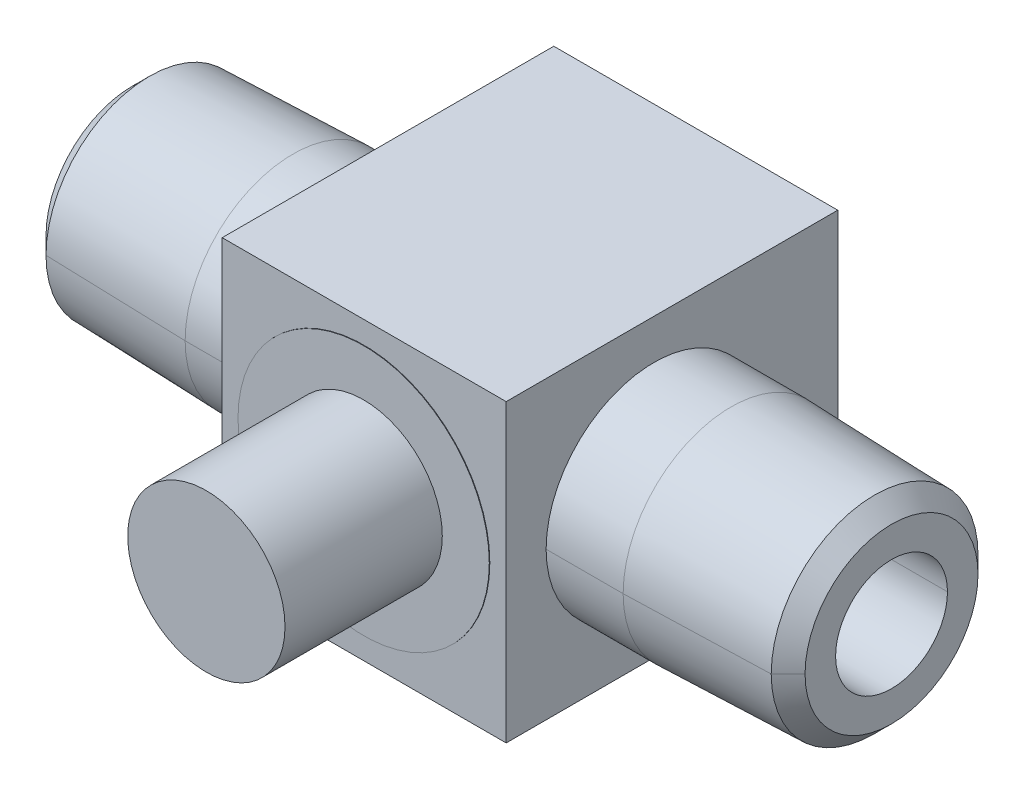
ISO-10303-21;
HEADER;
FILE_DESCRIPTION(('STEP AP214'),'2;1');
FILE_NAME('part.step','',(''),(''),'','','');
FILE_SCHEMA(('AUTOMOTIVE_DESIGN { 1 0 10303 214 1 1 1 1 }'));
ENDSEC;
DATA;
#1=APPLICATION_CONTEXT('core data for automotive mechanical design processes');
#2=APPLICATION_PROTOCOL_DEFINITION('international standard','automotive_design',2000,#1);
#3=PRODUCT_CONTEXT('',#1,'mechanical');
#4=PRODUCT('Part','Part','',(#3));
#5=PRODUCT_RELATED_PRODUCT_CATEGORY('part','',(#4));
#6=PRODUCT_DEFINITION_FORMATION('','',#4);
#7=PRODUCT_DEFINITION_CONTEXT('part definition',#1,'design');
#8=PRODUCT_DEFINITION('design','',#6,#7);
#9=PRODUCT_DEFINITION_SHAPE('','',#8);
#10=(LENGTH_UNIT() NAMED_UNIT(*) SI_UNIT(.MILLI.,.METRE.));
#11=(NAMED_UNIT(*) PLANE_ANGLE_UNIT() SI_UNIT($,.RADIAN.));
#12=(NAMED_UNIT(*) SI_UNIT($,.STERADIAN.) SOLID_ANGLE_UNIT());
#13=UNCERTAINTY_MEASURE_WITH_UNIT(LENGTH_MEASURE(1.E-05),#10,'distance_accuracy_value','');
#14=(GEOMETRIC_REPRESENTATION_CONTEXT(3) GLOBAL_UNCERTAINTY_ASSIGNED_CONTEXT((#13)) GLOBAL_UNIT_ASSIGNED_CONTEXT((#10,
#11,#12)) REPRESENTATION_CONTEXT('',''));
#15=CARTESIAN_POINT('',(0.,0.,0.));
#16=DIRECTION('',(0.,0.,1.));
#17=DIRECTION('',(1.,0.,0.));
#18=AXIS2_PLACEMENT_3D('',#15,#16,#17);
#19=CARTESIAN_POINT('',(0.,0.,21.844));
#20=DIRECTION('',(0.,0.,-1.));
#21=DIRECTION('',(1.,0.,0.));
#22=AXIS2_PLACEMENT_3D('',#19,#20,#21);
#23=CYLINDRICAL_SURFACE('',#22,7.9883);
#24=CARTESIAN_POINT('',(0.,0.,21.116));
#25=DIRECTION('',(0.,0.,-1.));
#26=DIRECTION('',(-1.,0.,0.));
#27=AXIS2_PLACEMENT_3D('',#24,#25,#26);
#28=CIRCLE('',#27,7.9883);
#29=CARTESIAN_POINT('',(-7.9883,0.,21.116));
#30=VERTEX_POINT('',#29);
#31=CARTESIAN_POINT('',(7.9883,0.,21.116));
#32=VERTEX_POINT('',#31);
#33=EDGE_CURVE('E57',#30,#32,#28,.F.);
#34=ORIENTED_EDGE('',*,*,#33,.F.);
#35=DIRECTION('',(0.,0.,1.));
#36=VECTOR('',#35,1.);
#37=CARTESIAN_POINT('',(-7.9883,0.,21.844));
#38=LINE('',#37,#36);
#39=CARTESIAN_POINT('',(-7.9883,0.,21.082));
#40=VERTEX_POINT('',#39);
#41=EDGE_CURVE('E69',#40,#30,#38,.T.);
#42=ORIENTED_EDGE('',*,*,#41,.F.);
#43=CARTESIAN_POINT('',(0.,0.,21.082));
#44=DIRECTION('',(0.,0.,-1.));
#45=DIRECTION('',(1.,0.,0.));
#46=AXIS2_PLACEMENT_3D('',#43,#44,#45);
#47=CIRCLE('',#46,7.9883);
#48=CARTESIAN_POINT('',(7.9883,0.,21.082));
#49=VERTEX_POINT('',#48);
#50=EDGE_CURVE('E295',#49,#40,#47,.T.);
#51=ORIENTED_EDGE('',*,*,#50,.F.);
#52=DIRECTION('',(0.,0.,-1.));
#53=VECTOR('',#52,1.);
#54=CARTESIAN_POINT('',(7.9883,0.,21.844));
#55=LINE('',#54,#53);
#56=EDGE_CURVE('E355',#32,#49,#55,.T.);
#57=ORIENTED_EDGE('',*,*,#56,.F.);
#58=EDGE_LOOP('',(#34,#42,#51,#57));
#59=FACE_BOUND('',#58,.T.);
#60=ADVANCED_FACE('F42',(#59),#23,.T.);
#61=CARTESIAN_POINT('',(0.,0.,21.844));
#62=DIRECTION('',(0.,0.,-1.));
#63=DIRECTION('',(1.,0.,0.));
#64=AXIS2_PLACEMENT_3D('',#61,#62,#63);
#65=CYLINDRICAL_SURFACE('',#64,7.9883);
#66=CARTESIAN_POINT('',(0.,0.,21.116));
#67=DIRECTION('',(0.,0.,-1.));
#68=DIRECTION('',(-1.,0.,0.));
#69=AXIS2_PLACEMENT_3D('',#66,#67,#68);
#70=CIRCLE('',#69,7.9883);
#71=EDGE_CURVE('E46',#32,#30,#70,.F.);
#72=ORIENTED_EDGE('',*,*,#71,.F.);
#73=ORIENTED_EDGE('',*,*,#56,.T.);
#74=CARTESIAN_POINT('',(0.,0.,21.082));
#75=DIRECTION('',(0.,0.,-1.));
#76=DIRECTION('',(1.,0.,0.));
#77=AXIS2_PLACEMENT_3D('',#74,#75,#76);
#78=CIRCLE('',#77,7.9883);
#79=EDGE_CURVE('E299',#40,#49,#78,.T.);
#80=ORIENTED_EDGE('',*,*,#79,.F.);
#81=ORIENTED_EDGE('',*,*,#41,.T.);
#82=EDGE_LOOP('',(#72,#73,#80,#81));
#83=FACE_BOUND('',#82,.T.);
#84=ADVANCED_FACE('F397',(#83),#65,.T.);
#85=CARTESIAN_POINT('',(0.,0.,21.082));
#86=DIRECTION('',(0.,0.,1.));
#87=DIRECTION('',(1.,0.,0.));
#88=AXIS2_PLACEMENT_3D('',#85,#86,#87);
#89=PLANE('',#88);
#90=DIRECTION('',(0.,1.,0.));
#91=VECTOR('',#90,1.);
#92=CARTESIAN_POINT('',(9.02716,0.,21.082));
#93=LINE('',#92,#91);
#94=CARTESIAN_POINT('',(9.02716,-9.398,21.082));
#95=VERTEX_POINT('',#94);
#96=CARTESIAN_POINT('',(9.02716,9.398,21.082));
#97=VERTEX_POINT('',#96);
#98=EDGE_CURVE('E300',#95,#97,#93,.T.);
#99=ORIENTED_EDGE('',*,*,#98,.T.);
#100=DIRECTION('',(-1.,0.,0.));
#101=VECTOR('',#100,1.);
#102=CARTESIAN_POINT('',(0.,9.398,21.082));
#103=LINE('',#102,#101);
#104=CARTESIAN_POINT('',(-9.02716,9.398,21.082));
#105=VERTEX_POINT('',#104);
#106=EDGE_CURVE('E345',#97,#105,#103,.T.);
#107=ORIENTED_EDGE('',*,*,#106,.T.);
#108=DIRECTION('',(0.,-1.,0.));
#109=VECTOR('',#108,1.);
#110=CARTESIAN_POINT('',(-9.02716,0.,21.082));
#111=LINE('',#110,#109);
#112=CARTESIAN_POINT('',(-9.02716,-9.398,21.082));
#113=VERTEX_POINT('',#112);
#114=EDGE_CURVE('E340',#105,#113,#111,.T.);
#115=ORIENTED_EDGE('',*,*,#114,.T.);
#116=DIRECTION('',(1.,0.,0.));
#117=VECTOR('',#116,1.);
#118=CARTESIAN_POINT('',(0.,-9.398,21.082));
#119=LINE('',#118,#117);
#120=EDGE_CURVE('E284',#113,#95,#119,.T.);
#121=ORIENTED_EDGE('',*,*,#120,.T.);
#122=EDGE_LOOP('',(#99,#107,#115,#121));
#123=FACE_BOUND('',#122,.T.);
#124=ORIENTED_EDGE('',*,*,#50,.T.);
#125=ORIENTED_EDGE('',*,*,#79,.T.);
#126=EDGE_LOOP('',(#124,#125));
#127=FACE_BOUND('',#126,.T.);
#128=ADVANCED_FACE('F44',(#123,#127),#89,.T.);
#129=CARTESIAN_POINT('',(9.02716,0.,10.541));
#130=DIRECTION('',(-1.,0.,0.));
#131=DIRECTION('',(0.,0.,1.));
#132=AXIS2_PLACEMENT_3D('',#129,#130,#131);
#133=PLANE('',#132);
#134=CARTESIAN_POINT('',(9.02716,0.,11.684));
#135=DIRECTION('',(-1.,0.,0.));
#136=DIRECTION('',(0.,0.,-1.));
#137=AXIS2_PLACEMENT_3D('',#134,#135,#136);
#138=CIRCLE('',#137,6.858);
#139=CARTESIAN_POINT('',(9.02716,0.,4.826));
#140=VERTEX_POINT('',#139);
#141=CARTESIAN_POINT('',(9.02716,0.,18.542));
#142=VERTEX_POINT('',#141);
#143=EDGE_CURVE('E236',#140,#142,#138,.T.);
#144=ORIENTED_EDGE('',*,*,#143,.T.);
#145=CARTESIAN_POINT('',(9.02716,0.,11.684));
#146=DIRECTION('',(-1.,0.,0.));
#147=DIRECTION('',(0.,0.,-1.));
#148=AXIS2_PLACEMENT_3D('',#145,#146,#147);
#149=CIRCLE('',#148,6.858);
#150=EDGE_CURVE('E237',#142,#140,#149,.T.);
#151=ORIENTED_EDGE('',*,*,#150,.T.);
#152=EDGE_LOOP('',(#144,#151));
#153=FACE_BOUND('',#152,.T.);
#154=DIRECTION('',(0.,0.,-1.));
#155=VECTOR('',#154,1.);
#156=CARTESIAN_POINT('',(9.02716,-9.398,10.541));
#157=LINE('',#156,#155);
#158=CARTESIAN_POINT('',(9.02716,-9.398,0.));
#159=VERTEX_POINT('',#158);
#160=EDGE_CURVE('E280',#95,#159,#157,.T.);
#161=ORIENTED_EDGE('',*,*,#160,.T.);
#162=DIRECTION('',(0.,-1.,0.));
#163=VECTOR('',#162,1.);
#164=CARTESIAN_POINT('',(9.02716,0.,0.));
#165=LINE('',#164,#163);
#166=CARTESIAN_POINT('',(9.02716,9.398,0.));
#167=VERTEX_POINT('',#166);
#168=EDGE_CURVE('E310',#167,#159,#165,.T.);
#169=ORIENTED_EDGE('',*,*,#168,.F.);
#170=DIRECTION('',(0.,0.,-1.));
#171=VECTOR('',#170,1.);
#172=CARTESIAN_POINT('',(9.02716,9.398,10.541));
#173=LINE('',#172,#171);
#174=EDGE_CURVE('E341',#97,#167,#173,.T.);
#175=ORIENTED_EDGE('',*,*,#174,.F.);
#176=ORIENTED_EDGE('',*,*,#98,.F.);
#177=EDGE_LOOP('',(#161,#169,#175,#176));
#178=FACE_BOUND('',#177,.T.);
#179=ADVANCED_FACE('F417',(#153,#178),#133,.F.);
#180=CARTESIAN_POINT('',(0.,9.398,10.541));
#181=DIRECTION('',(0.,-1.,0.));
#182=DIRECTION('',(0.,0.,-1.));
#183=AXIS2_PLACEMENT_3D('',#180,#181,#182);
#184=PLANE('',#183);
#185=ORIENTED_EDGE('',*,*,#174,.T.);
#186=DIRECTION('',(1.,0.,0.));
#187=VECTOR('',#186,1.);
#188=CARTESIAN_POINT('',(0.,9.398,0.));
#189=LINE('',#188,#187);
#190=CARTESIAN_POINT('',(-9.02716,9.398,0.));
#191=VERTEX_POINT('',#190);
#192=EDGE_CURVE('E290',#191,#167,#189,.T.);
#193=ORIENTED_EDGE('',*,*,#192,.F.);
#194=DIRECTION('',(0.,0.,-1.));
#195=VECTOR('',#194,1.);
#196=CARTESIAN_POINT('',(-9.02716,9.398,10.541));
#197=LINE('',#196,#195);
#198=EDGE_CURVE('E334',#105,#191,#197,.T.);
#199=ORIENTED_EDGE('',*,*,#198,.F.);
#200=ORIENTED_EDGE('',*,*,#106,.F.);
#201=EDGE_LOOP('',(#185,#193,#199,#200));
#202=FACE_BOUND('',#201,.T.);
#203=ADVANCED_FACE('F420',(#202),#184,.F.);
#204=CARTESIAN_POINT('',(-9.02716,0.,10.541));
#205=DIRECTION('',(1.,0.,0.));
#206=DIRECTION('',(0.,1.,0.));
#207=AXIS2_PLACEMENT_3D('',#204,#205,#206);
#208=PLANE('',#207);
#209=CARTESIAN_POINT('',(-9.02716,0.,11.684));
#210=DIRECTION('',(1.,0.,0.));
#211=DIRECTION('',(0.,0.,-1.));
#212=AXIS2_PLACEMENT_3D('',#209,#210,#211);
#213=CIRCLE('',#212,6.858);
#214=CARTESIAN_POINT('',(-9.02716,0.,4.826));
#215=VERTEX_POINT('',#214);
#216=CARTESIAN_POINT('',(-9.02716,0.,18.542));
#217=VERTEX_POINT('',#216);
#218=EDGE_CURVE('E241',#215,#217,#213,.T.);
#219=ORIENTED_EDGE('',*,*,#218,.T.);
#220=CARTESIAN_POINT('',(-9.02716,0.,11.684));
#221=DIRECTION('',(1.,0.,0.));
#222=DIRECTION('',(0.,0.,-1.));
#223=AXIS2_PLACEMENT_3D('',#220,#221,#222);
#224=CIRCLE('',#223,6.858);
#225=EDGE_CURVE('E212',#217,#215,#224,.T.);
#226=ORIENTED_EDGE('',*,*,#225,.T.);
#227=EDGE_LOOP('',(#219,#226));
#228=FACE_BOUND('',#227,.T.);
#229=ORIENTED_EDGE('',*,*,#198,.T.);
#230=DIRECTION('',(0.,1.,0.));
#231=VECTOR('',#230,1.);
#232=CARTESIAN_POINT('',(-9.02716,0.,0.));
#233=LINE('',#232,#231);
#234=CARTESIAN_POINT('',(-9.02716,-9.398,0.));
#235=VERTEX_POINT('',#234);
#236=EDGE_CURVE('E286',#235,#191,#233,.T.);
#237=ORIENTED_EDGE('',*,*,#236,.F.);
#238=DIRECTION('',(0.,0.,-1.));
#239=VECTOR('',#238,1.);
#240=CARTESIAN_POINT('',(-9.02716,-9.398,10.541));
#241=LINE('',#240,#239);
#242=EDGE_CURVE('E285',#113,#235,#241,.T.);
#243=ORIENTED_EDGE('',*,*,#242,.F.);
#244=ORIENTED_EDGE('',*,*,#114,.F.);
#245=EDGE_LOOP('',(#229,#237,#243,#244));
#246=FACE_BOUND('',#245,.T.);
#247=ADVANCED_FACE('F440',(#228,#246),#208,.F.);
#248=CARTESIAN_POINT('',(0.,-9.398,10.541));
#249=DIRECTION('',(0.,1.,0.));
#250=DIRECTION('',(1.,0.,0.));
#251=AXIS2_PLACEMENT_3D('',#248,#249,#250);
#252=PLANE('',#251);
#253=ORIENTED_EDGE('',*,*,#242,.T.);
#254=DIRECTION('',(-1.,0.,0.));
#255=VECTOR('',#254,1.);
#256=CARTESIAN_POINT('',(0.,-9.398,0.));
#257=LINE('',#256,#255);
#258=EDGE_CURVE('E291',#159,#235,#257,.T.);
#259=ORIENTED_EDGE('',*,*,#258,.F.);
#260=ORIENTED_EDGE('',*,*,#160,.F.);
#261=ORIENTED_EDGE('',*,*,#120,.F.);
#262=EDGE_LOOP('',(#253,#259,#260,#261));
#263=FACE_BOUND('',#262,.T.);
#264=ADVANCED_FACE('F438',(#263),#252,.F.);
#265=CARTESIAN_POINT('',(0.,0.,0.));
#266=DIRECTION('',(0.,0.,1.));
#267=DIRECTION('',(1.,0.,0.));
#268=AXIS2_PLACEMENT_3D('',#265,#266,#267);
#269=PLANE('',#268);
#270=ORIENTED_EDGE('',*,*,#168,.T.);
#271=ORIENTED_EDGE('',*,*,#258,.T.);
#272=ORIENTED_EDGE('',*,*,#236,.T.);
#273=ORIENTED_EDGE('',*,*,#192,.T.);
#274=EDGE_LOOP('',(#270,#271,#272,#273));
#275=FACE_BOUND('',#274,.T.);
#276=ADVANCED_FACE('F435',(#275),#269,.F.);
#277=CARTESIAN_POINT('',(11.47572,0.,11.684));
#278=DIRECTION('',(-1.,0.,0.));
#279=DIRECTION('',(0.,0.,-1.));
#280=AXIS2_PLACEMENT_3D('',#277,#278,#279);
#281=CYLINDRICAL_SURFACE('',#280,6.858);
#282=DIRECTION('',(-1.,0.,0.));
#283=VECTOR('',#282,1.);
#284=CARTESIAN_POINT('',(11.47572,0.,4.826));
#285=LINE('',#284,#283);
#286=CARTESIAN_POINT('',(13.92428,0.,4.826));
#287=VERTEX_POINT('',#286);
#288=EDGE_CURVE('E272',#287,#140,#285,.T.);
#289=ORIENTED_EDGE('',*,*,#288,.F.);
#290=CARTESIAN_POINT('',(13.92428,0.,11.684));
#291=DIRECTION('',(-1.,0.,0.));
#292=DIRECTION('',(0.,0.,-1.));
#293=AXIS2_PLACEMENT_3D('',#290,#291,#292);
#294=CIRCLE('',#293,6.858);
#295=CARTESIAN_POINT('',(13.92428,0.,18.542));
#296=VERTEX_POINT('',#295);
#297=EDGE_CURVE('E232',#287,#296,#294,.T.);
#298=ORIENTED_EDGE('',*,*,#297,.T.);
#299=DIRECTION('',(1.,0.,0.));
#300=VECTOR('',#299,1.);
#301=CARTESIAN_POINT('',(11.47572,0.,18.542));
#302=LINE('',#301,#300);
#303=EDGE_CURVE('E233',#142,#296,#302,.T.);
#304=ORIENTED_EDGE('',*,*,#303,.F.);
#305=ORIENTED_EDGE('',*,*,#143,.F.);
#306=EDGE_LOOP('',(#289,#298,#304,#305));
#307=FACE_BOUND('',#306,.T.);
#308=ADVANCED_FACE('F437',(#307),#281,.T.);
#309=CARTESIAN_POINT('',(11.47572,0.,11.684));
#310=DIRECTION('',(-1.,0.,0.));
#311=DIRECTION('',(0.,0.,-1.));
#312=AXIS2_PLACEMENT_3D('',#309,#310,#311);
#313=CYLINDRICAL_SURFACE('',#312,6.858);
#314=ORIENTED_EDGE('',*,*,#288,.T.);
#315=ORIENTED_EDGE('',*,*,#150,.F.);
#316=ORIENTED_EDGE('',*,*,#303,.T.);
#317=CARTESIAN_POINT('',(13.92428,0.,11.684));
#318=DIRECTION('',(-1.,0.,0.));
#319=DIRECTION('',(0.,0.,-1.));
#320=AXIS2_PLACEMENT_3D('',#317,#318,#319);
#321=CIRCLE('',#320,6.858);
#322=EDGE_CURVE('E210',#296,#287,#321,.T.);
#323=ORIENTED_EDGE('',*,*,#322,.T.);
#324=EDGE_LOOP('',(#314,#315,#316,#323));
#325=FACE_BOUND('',#324,.T.);
#326=ADVANCED_FACE('F411',(#325),#313,.T.);
#327=CARTESIAN_POINT('',(-11.47572,0.,11.684));
#328=DIRECTION('',(1.,0.,0.));
#329=DIRECTION('',(0.,0.,-1.));
#330=AXIS2_PLACEMENT_3D('',#327,#328,#329);
#331=CYLINDRICAL_SURFACE('',#330,6.858);
#332=DIRECTION('',(1.,0.,0.));
#333=VECTOR('',#332,1.);
#334=CARTESIAN_POINT('',(-11.47572,0.,4.826));
#335=LINE('',#334,#333);
#336=CARTESIAN_POINT('',(-13.92428,0.,4.826));
#337=VERTEX_POINT('',#336);
#338=EDGE_CURVE('E216',#337,#215,#335,.T.);
#339=ORIENTED_EDGE('',*,*,#338,.F.);
#340=CARTESIAN_POINT('',(-13.92428,0.,11.684));
#341=DIRECTION('',(1.,0.,0.));
#342=DIRECTION('',(0.,0.,-1.));
#343=AXIS2_PLACEMENT_3D('',#340,#341,#342);
#344=CIRCLE('',#343,6.858);
#345=CARTESIAN_POINT('',(-13.92428,0.,18.542));
#346=VERTEX_POINT('',#345);
#347=EDGE_CURVE('E269',#337,#346,#344,.T.);
#348=ORIENTED_EDGE('',*,*,#347,.T.);
#349=DIRECTION('',(-1.,0.,0.));
#350=VECTOR('',#349,1.);
#351=CARTESIAN_POINT('',(-11.47572,0.,18.542));
#352=LINE('',#351,#350);
#353=EDGE_CURVE('E215',#217,#346,#352,.T.);
#354=ORIENTED_EDGE('',*,*,#353,.F.);
#355=ORIENTED_EDGE('',*,*,#218,.F.);
#356=EDGE_LOOP('',(#339,#348,#354,#355));
#357=FACE_BOUND('',#356,.T.);
#358=ADVANCED_FACE('F407',(#357),#331,.T.);
#359=CARTESIAN_POINT('',(-11.47572,0.,11.684));
#360=DIRECTION('',(1.,0.,0.));
#361=DIRECTION('',(0.,0.,-1.));
#362=AXIS2_PLACEMENT_3D('',#359,#360,#361);
#363=CYLINDRICAL_SURFACE('',#362,6.858);
#364=ORIENTED_EDGE('',*,*,#338,.T.);
#365=ORIENTED_EDGE('',*,*,#225,.F.);
#366=ORIENTED_EDGE('',*,*,#353,.T.);
#367=CARTESIAN_POINT('',(-13.92428,0.,11.684));
#368=DIRECTION('',(1.,0.,0.));
#369=DIRECTION('',(0.,0.,-1.));
#370=AXIS2_PLACEMENT_3D('',#367,#368,#369);
#371=CIRCLE('',#370,6.858);
#372=EDGE_CURVE('E256',#346,#337,#371,.T.);
#373=ORIENTED_EDGE('',*,*,#372,.T.);
#374=EDGE_LOOP('',(#364,#365,#366,#373));
#375=FACE_BOUND('',#374,.T.);
#376=ADVANCED_FACE('F410',(#375),#363,.T.);
#377=CARTESIAN_POINT('',(19.02714,0.,11.684));
#378=DIRECTION('',(-1.,0.,0.));
#379=DIRECTION('',(0.,0.,-1.));
#380=AXIS2_PLACEMENT_3D('',#377,#378,#379);
#381=CONICAL_SURFACE('',#380,6.69912197832236,0.0311250383214148);
#382=DIRECTION('',(-0.999515655098127,0.,-0.0311200130745937));
#383=VECTOR('',#382,1.);
#384=CARTESIAN_POINT('',(19.02714,0.,4.98487802167764));
#385=LINE('',#384,#383);
#386=CARTESIAN_POINT('',(23.0540874044187,0.,5.11025740441868));
#387=VERTEX_POINT('',#386);
#388=EDGE_CURVE('E265',#387,#287,#385,.T.);
#389=ORIENTED_EDGE('',*,*,#388,.F.);
#390=CARTESIAN_POINT('',(23.0540874044187,0.,11.684));
#391=DIRECTION('',(-1.,0.,0.));
#392=DIRECTION('',(0.,0.,-1.));
#393=AXIS2_PLACEMENT_3D('',#390,#391,#392);
#394=CIRCLE('',#393,6.57374259558132);
#395=CARTESIAN_POINT('',(23.0540874044187,0.,18.2577425955813));
#396=VERTEX_POINT('',#395);
#397=EDGE_CURVE('E251',#387,#396,#394,.T.);
#398=ORIENTED_EDGE('',*,*,#397,.T.);
#399=DIRECTION('',(0.999515655098127,0.,-0.0311200130745935));
#400=VECTOR('',#399,1.);
#401=CARTESIAN_POINT('',(19.02714,0.,18.3831219783224));
#402=LINE('',#401,#400);
#403=EDGE_CURVE('E228',#296,#396,#402,.T.);
#404=ORIENTED_EDGE('',*,*,#403,.F.);
#405=ORIENTED_EDGE('',*,*,#297,.F.);
#406=EDGE_LOOP('',(#389,#398,#404,#405));
#407=FACE_BOUND('',#406,.T.);
#408=ADVANCED_FACE('F426',(#407),#381,.T.);
#409=CARTESIAN_POINT('',(19.02714,0.,11.684));
#410=DIRECTION('',(-1.,0.,0.));
#411=DIRECTION('',(0.,0.,-1.));
#412=AXIS2_PLACEMENT_3D('',#409,#410,#411);
#413=CONICAL_SURFACE('',#412,6.69912197832236,0.0311250383214148);
#414=ORIENTED_EDGE('',*,*,#388,.T.);
#415=ORIENTED_EDGE('',*,*,#322,.F.);
#416=ORIENTED_EDGE('',*,*,#403,.T.);
#417=CARTESIAN_POINT('',(23.0540874044187,0.,11.684));
#418=DIRECTION('',(-1.,0.,0.));
#419=DIRECTION('',(0.,0.,-1.));
#420=AXIS2_PLACEMENT_3D('',#417,#418,#419);
#421=CIRCLE('',#420,6.57374259558132);
#422=EDGE_CURVE('E222',#396,#387,#421,.T.);
#423=ORIENTED_EDGE('',*,*,#422,.T.);
#424=EDGE_LOOP('',(#414,#415,#416,#423));
#425=FACE_BOUND('',#424,.T.);
#426=ADVANCED_FACE('F405',(#425),#413,.T.);
#427=CARTESIAN_POINT('',(-19.02714,0.,11.684));
#428=DIRECTION('',(1.,0.,0.));
#429=DIRECTION('',(0.,0.,-1.));
#430=AXIS2_PLACEMENT_3D('',#427,#428,#429);
#431=CONICAL_SURFACE('',#430,6.69912197832236,0.0311250383214148);
#432=DIRECTION('',(0.999515655098127,0.,-0.0311200130745937));
#433=VECTOR('',#432,1.);
#434=CARTESIAN_POINT('',(-19.02714,0.,4.98487802167764));
#435=LINE('',#434,#433);
#436=CARTESIAN_POINT('',(-23.0540874044187,0.,5.11025740441868));
#437=VERTEX_POINT('',#436);
#438=EDGE_CURVE('E113',#437,#337,#435,.T.);
#439=ORIENTED_EDGE('',*,*,#438,.F.);
#440=CARTESIAN_POINT('',(-23.0540874044187,0.,11.684));
#441=DIRECTION('',(1.,0.,0.));
#442=DIRECTION('',(0.,0.,-1.));
#443=AXIS2_PLACEMENT_3D('',#440,#441,#442);
#444=CIRCLE('',#443,6.57374259558132);
#445=CARTESIAN_POINT('',(-23.0540874044187,0.,18.2577425955813));
#446=VERTEX_POINT('',#445);
#447=EDGE_CURVE('E255',#437,#446,#444,.T.);
#448=ORIENTED_EDGE('',*,*,#447,.T.);
#449=DIRECTION('',(-0.999515655098127,0.,-0.0311200130745935));
#450=VECTOR('',#449,1.);
#451=CARTESIAN_POINT('',(-19.02714,0.,18.3831219783224));
#452=LINE('',#451,#450);
#453=EDGE_CURVE('E97',#346,#446,#452,.T.);
#454=ORIENTED_EDGE('',*,*,#453,.F.);
#455=ORIENTED_EDGE('',*,*,#347,.F.);
#456=EDGE_LOOP('',(#439,#448,#454,#455));
#457=FACE_BOUND('',#456,.T.);
#458=ADVANCED_FACE('F422',(#457),#431,.T.);
#459=CARTESIAN_POINT('',(-19.02714,0.,11.684));
#460=DIRECTION('',(1.,0.,0.));
#461=DIRECTION('',(0.,0.,-1.));
#462=AXIS2_PLACEMENT_3D('',#459,#460,#461);
#463=CONICAL_SURFACE('',#462,6.69912197832236,0.0311250383214148);
#464=ORIENTED_EDGE('',*,*,#438,.T.);
#465=ORIENTED_EDGE('',*,*,#372,.F.);
#466=ORIENTED_EDGE('',*,*,#453,.T.);
#467=CARTESIAN_POINT('',(-23.0540874044187,0.,11.684));
#468=DIRECTION('',(1.,0.,0.));
#469=DIRECTION('',(0.,0.,-1.));
#470=AXIS2_PLACEMENT_3D('',#467,#468,#469);
#471=CIRCLE('',#470,6.57374259558132);
#472=EDGE_CURVE('E217',#446,#437,#471,.T.);
#473=ORIENTED_EDGE('',*,*,#472,.T.);
#474=EDGE_LOOP('',(#464,#465,#466,#473));
#475=FACE_BOUND('',#474,.T.);
#476=ADVANCED_FACE('F425',(#475),#463,.T.);
#477=CARTESIAN_POINT('',(23.449915,0.,11.684));
#478=DIRECTION('',(-1.,0.,0.));
#479=DIRECTION('',(0.,0.,-1.));
#480=AXIS2_PLACEMENT_3D('',#477,#478,#479);
#481=CONICAL_SURFACE('',#480,6.177915,0.785398163397449);
#482=DIRECTION('',(0.707106781186547,0.,0.707106781186548));
#483=VECTOR('',#482,1.);
#484=CARTESIAN_POINT('',(23.449915,0.,5.506085));
#485=LINE('',#484,#483);
#486=CARTESIAN_POINT('',(24.13,0.,6.18617));
#487=VERTEX_POINT('',#486);
#488=EDGE_CURVE('E227',#387,#487,#485,.T.);
#489=ORIENTED_EDGE('',*,*,#488,.T.);
#490=CARTESIAN_POINT('',(24.13,0.,11.684));
#491=DIRECTION('',(1.,0.,0.));
#492=DIRECTION('',(0.,0.,-1.));
#493=AXIS2_PLACEMENT_3D('',#490,#491,#492);
#494=CIRCLE('',#493,5.49783);
#495=CARTESIAN_POINT('',(24.13,0.,17.18183));
#496=VERTEX_POINT('',#495);
#497=EDGE_CURVE('E246',#496,#487,#494,.T.);
#498=ORIENTED_EDGE('',*,*,#497,.F.);
#499=DIRECTION('',(-0.707106781186547,0.,0.707106781186548));
#500=VECTOR('',#499,1.);
#501=CARTESIAN_POINT('',(23.449915,0.,17.861915));
#502=LINE('',#501,#500);
#503=EDGE_CURVE('E226',#496,#396,#502,.T.);
#504=ORIENTED_EDGE('',*,*,#503,.T.);
#505=ORIENTED_EDGE('',*,*,#397,.F.);
#506=EDGE_LOOP('',(#489,#498,#504,#505));
#507=FACE_BOUND('',#506,.T.);
#508=ADVANCED_FACE('F577',(#507),#481,.T.);
#509=CARTESIAN_POINT('',(23.449915,0.,11.684));
#510=DIRECTION('',(-1.,0.,0.));
#511=DIRECTION('',(0.,0.,-1.));
#512=AXIS2_PLACEMENT_3D('',#509,#510,#511);
#513=CONICAL_SURFACE('',#512,6.177915,0.785398163397449);
#514=ORIENTED_EDGE('',*,*,#488,.F.);
#515=ORIENTED_EDGE('',*,*,#422,.F.);
#516=ORIENTED_EDGE('',*,*,#503,.F.);
#517=CARTESIAN_POINT('',(24.13,0.,11.684));
#518=DIRECTION('',(1.,0.,0.));
#519=DIRECTION('',(0.,0.,-1.));
#520=AXIS2_PLACEMENT_3D('',#517,#518,#519);
#521=CIRCLE('',#520,5.49783);
#522=EDGE_CURVE('E242',#487,#496,#521,.T.);
#523=ORIENTED_EDGE('',*,*,#522,.F.);
#524=EDGE_LOOP('',(#514,#515,#516,#523));
#525=FACE_BOUND('',#524,.T.);
#526=ADVANCED_FACE('F582',(#525),#513,.T.);
#527=CARTESIAN_POINT('',(-23.449915,0.,11.684));
#528=DIRECTION('',(1.,0.,0.));
#529=DIRECTION('',(0.,0.,-1.));
#530=AXIS2_PLACEMENT_3D('',#527,#528,#529);
#531=CONICAL_SURFACE('',#530,6.177915,0.785398163397449);
#532=DIRECTION('',(-0.707106781186547,0.,0.707106781186548));
#533=VECTOR('',#532,1.);
#534=CARTESIAN_POINT('',(-23.449915,0.,5.506085));
#535=LINE('',#534,#533);
#536=CARTESIAN_POINT('',(-24.13,0.,6.18617));
#537=VERTEX_POINT('',#536);
#538=EDGE_CURVE('E221',#437,#537,#535,.T.);
#539=ORIENTED_EDGE('',*,*,#538,.T.);
#540=CARTESIAN_POINT('',(-24.13,0.,11.684));
#541=DIRECTION('',(-1.,0.,0.));
#542=DIRECTION('',(0.,0.,-1.));
#543=AXIS2_PLACEMENT_3D('',#540,#541,#542);
#544=CIRCLE('',#543,5.49783);
#545=CARTESIAN_POINT('',(-24.13,0.,17.18183));
#546=VERTEX_POINT('',#545);
#547=EDGE_CURVE('E247',#546,#537,#544,.T.);
#548=ORIENTED_EDGE('',*,*,#547,.F.);
#549=DIRECTION('',(0.707106781186547,0.,0.707106781186548));
#550=VECTOR('',#549,1.);
#551=CARTESIAN_POINT('',(-23.449915,0.,17.861915));
#552=LINE('',#551,#550);
#553=EDGE_CURVE('E220',#546,#446,#552,.T.);
#554=ORIENTED_EDGE('',*,*,#553,.T.);
#555=ORIENTED_EDGE('',*,*,#447,.F.);
#556=EDGE_LOOP('',(#539,#548,#554,#555));
#557=FACE_BOUND('',#556,.T.);
#558=ADVANCED_FACE('F528',(#557),#531,.T.);
#559=CARTESIAN_POINT('',(-23.449915,0.,11.684));
#560=DIRECTION('',(1.,0.,0.));
#561=DIRECTION('',(0.,0.,-1.));
#562=AXIS2_PLACEMENT_3D('',#559,#560,#561);
#563=CONICAL_SURFACE('',#562,6.177915,0.785398163397449);
#564=ORIENTED_EDGE('',*,*,#538,.F.);
#565=ORIENTED_EDGE('',*,*,#472,.F.);
#566=ORIENTED_EDGE('',*,*,#553,.F.);
#567=CARTESIAN_POINT('',(-24.13,0.,11.684));
#568=DIRECTION('',(-1.,0.,0.));
#569=DIRECTION('',(0.,0.,-1.));
#570=AXIS2_PLACEMENT_3D('',#567,#568,#569);
#571=CIRCLE('',#570,5.49783);
#572=EDGE_CURVE('E275',#537,#546,#571,.T.);
#573=ORIENTED_EDGE('',*,*,#572,.F.);
#574=EDGE_LOOP('',(#564,#565,#566,#573));
#575=FACE_BOUND('',#574,.T.);
#576=ADVANCED_FACE('F391',(#575),#563,.T.);
#577=CARTESIAN_POINT('',(24.13,0.,8.41387802167764));
#578=DIRECTION('',(1.,0.,0.));
#579=DIRECTION('',(0.,0.,1.));
#580=AXIS2_PLACEMENT_3D('',#577,#578,#579);
#581=PLANE('',#580);
#582=ORIENTED_EDGE('',*,*,#522,.T.);
#583=ORIENTED_EDGE('',*,*,#497,.T.);
#584=EDGE_LOOP('',(#582,#583));
#585=FACE_BOUND('',#584,.T.);
#586=CARTESIAN_POINT('',(24.13,0.,11.684));
#587=DIRECTION('',(-1.,0.,0.));
#588=DIRECTION('',(0.,0.,-1.));
#589=AXIS2_PLACEMENT_3D('',#586,#587,#588);
#590=CIRCLE('',#589,3.556);
#591=CARTESIAN_POINT('',(24.13,0.,8.128));
#592=VERTEX_POINT('',#591);
#593=CARTESIAN_POINT('',(24.13,0.,15.24));
#594=VERTEX_POINT('',#593);
#595=EDGE_CURVE('E189',#592,#594,#590,.T.);
#596=ORIENTED_EDGE('',*,*,#595,.T.);
#597=CARTESIAN_POINT('',(24.13,0.,11.684));
#598=DIRECTION('',(-1.,0.,0.));
#599=DIRECTION('',(0.,0.,-1.));
#600=AXIS2_PLACEMENT_3D('',#597,#598,#599);
#601=CIRCLE('',#600,3.556);
#602=EDGE_CURVE('E187',#594,#592,#601,.T.);
#603=ORIENTED_EDGE('',*,*,#602,.T.);
#604=EDGE_LOOP('',(#596,#603));
#605=FACE_BOUND('',#604,.T.);
#606=ADVANCED_FACE('F383',(#585,#605),#581,.T.);
#607=CARTESIAN_POINT('',(-24.13,0.,8.41387802167764));
#608=DIRECTION('',(-1.,0.,0.));
#609=DIRECTION('',(0.,0.,1.));
#610=AXIS2_PLACEMENT_3D('',#607,#608,#609);
#611=PLANE('',#610);
#612=ORIENTED_EDGE('',*,*,#572,.T.);
#613=ORIENTED_EDGE('',*,*,#547,.T.);
#614=EDGE_LOOP('',(#612,#613));
#615=FACE_BOUND('',#614,.T.);
#616=CARTESIAN_POINT('',(-24.13,0.,11.684));
#617=DIRECTION('',(1.,0.,0.));
#618=DIRECTION('',(0.,0.,-1.));
#619=AXIS2_PLACEMENT_3D('',#616,#617,#618);
#620=CIRCLE('',#619,3.556);
#621=CARTESIAN_POINT('',(-24.13,0.,8.128));
#622=VERTEX_POINT('',#621);
#623=CARTESIAN_POINT('',(-24.13,0.,15.24));
#624=VERTEX_POINT('',#623);
#625=EDGE_CURVE('E260',#622,#624,#620,.T.);
#626=ORIENTED_EDGE('',*,*,#625,.T.);
#627=CARTESIAN_POINT('',(-24.13,0.,11.684));
#628=DIRECTION('',(1.,0.,0.));
#629=DIRECTION('',(0.,0.,-1.));
#630=AXIS2_PLACEMENT_3D('',#627,#628,#629);
#631=CIRCLE('',#630,3.556);
#632=EDGE_CURVE('E330',#624,#622,#631,.T.);
#633=ORIENTED_EDGE('',*,*,#632,.T.);
#634=EDGE_LOOP('',(#626,#633));
#635=FACE_BOUND('',#634,.T.);
#636=ADVANCED_FACE('F381',(#615,#635),#611,.T.);
#637=CARTESIAN_POINT('',(16.57858,0.,11.684));
#638=DIRECTION('',(1.,0.,0.));
#639=DIRECTION('',(0.,0.,-1.));
#640=AXIS2_PLACEMENT_3D('',#637,#638,#639);
#641=CYLINDRICAL_SURFACE('',#640,3.556);
#642=DIRECTION('',(-1.,0.,0.));
#643=VECTOR('',#642,1.);
#644=CARTESIAN_POINT('',(16.57858,0.,8.128));
#645=LINE('',#644,#643);
#646=CARTESIAN_POINT('',(9.02716,0.,8.128));
#647=VERTEX_POINT('',#646);
#648=EDGE_CURVE('E174',#592,#647,#645,.T.);
#649=ORIENTED_EDGE('',*,*,#648,.T.);
#650=CARTESIAN_POINT('',(9.02716,0.,11.684));
#651=DIRECTION('',(1.,0.,0.));
#652=DIRECTION('',(0.,0.,-1.));
#653=AXIS2_PLACEMENT_3D('',#650,#651,#652);
#654=CIRCLE('',#653,3.556);
#655=CARTESIAN_POINT('',(9.02716,0.,15.24));
#656=VERTEX_POINT('',#655);
#657=EDGE_CURVE('E191',#656,#647,#654,.T.);
#658=ORIENTED_EDGE('',*,*,#657,.F.);
#659=DIRECTION('',(1.,0.,0.));
#660=VECTOR('',#659,1.);
#661=CARTESIAN_POINT('',(16.57858,0.,15.24));
#662=LINE('',#661,#660);
#663=EDGE_CURVE('E182',#656,#594,#662,.T.);
#664=ORIENTED_EDGE('',*,*,#663,.T.);
#665=ORIENTED_EDGE('',*,*,#595,.F.);
#666=EDGE_LOOP('',(#649,#658,#664,#665));
#667=FACE_BOUND('',#666,.T.);
#668=ADVANCED_FACE('F192',(#667),#641,.F.);
#669=CARTESIAN_POINT('',(16.57858,0.,11.684));
#670=DIRECTION('',(1.,0.,0.));
#671=DIRECTION('',(0.,0.,-1.));
#672=AXIS2_PLACEMENT_3D('',#669,#670,#671);
#673=CYLINDRICAL_SURFACE('',#672,3.556);
#674=ORIENTED_EDGE('',*,*,#648,.F.);
#675=ORIENTED_EDGE('',*,*,#602,.F.);
#676=ORIENTED_EDGE('',*,*,#663,.F.);
#677=CARTESIAN_POINT('',(9.02716,0.,11.684));
#678=DIRECTION('',(1.,0.,0.));
#679=DIRECTION('',(0.,0.,-1.));
#680=AXIS2_PLACEMENT_3D('',#677,#678,#679);
#681=CIRCLE('',#680,3.556);
#682=EDGE_CURVE('E185',#647,#656,#681,.T.);
#683=ORIENTED_EDGE('',*,*,#682,.F.);
#684=EDGE_LOOP('',(#674,#675,#676,#683));
#685=FACE_BOUND('',#684,.T.);
#686=ADVANCED_FACE('F183',(#685),#673,.F.);
#687=CARTESIAN_POINT('',(-16.57858,0.,11.684));
#688=DIRECTION('',(-1.,0.,0.));
#689=DIRECTION('',(0.,0.,-1.));
#690=AXIS2_PLACEMENT_3D('',#687,#688,#689);
#691=CYLINDRICAL_SURFACE('',#690,3.556);
#692=DIRECTION('',(1.,0.,0.));
#693=VECTOR('',#692,1.);
#694=CARTESIAN_POINT('',(-16.57858,0.,8.128));
#695=LINE('',#694,#693);
#696=CARTESIAN_POINT('',(-9.02716,0.,8.128));
#697=VERTEX_POINT('',#696);
#698=EDGE_CURVE('E195',#622,#697,#695,.T.);
#699=ORIENTED_EDGE('',*,*,#698,.T.);
#700=CARTESIAN_POINT('',(-9.02716,0.,11.684));
#701=DIRECTION('',(-1.,0.,0.));
#702=DIRECTION('',(0.,0.,-1.));
#703=AXIS2_PLACEMENT_3D('',#700,#701,#702);
#704=CIRCLE('',#703,3.556);
#705=CARTESIAN_POINT('',(-9.02716,0.,15.24));
#706=VERTEX_POINT('',#705);
#707=EDGE_CURVE('E199',#706,#697,#704,.T.);
#708=ORIENTED_EDGE('',*,*,#707,.F.);
#709=DIRECTION('',(-1.,0.,0.));
#710=VECTOR('',#709,1.);
#711=CARTESIAN_POINT('',(-16.57858,0.,15.24));
#712=LINE('',#711,#710);
#713=EDGE_CURVE('E264',#706,#624,#712,.T.);
#714=ORIENTED_EDGE('',*,*,#713,.T.);
#715=ORIENTED_EDGE('',*,*,#625,.F.);
#716=EDGE_LOOP('',(#699,#708,#714,#715));
#717=FACE_BOUND('',#716,.T.);
#718=ADVANCED_FACE('F374',(#717),#691,.F.);
#719=CARTESIAN_POINT('',(-16.57858,0.,11.684));
#720=DIRECTION('',(-1.,0.,0.));
#721=DIRECTION('',(0.,0.,-1.));
#722=AXIS2_PLACEMENT_3D('',#719,#720,#721);
#723=CYLINDRICAL_SURFACE('',#722,3.556);
#724=ORIENTED_EDGE('',*,*,#698,.F.);
#725=ORIENTED_EDGE('',*,*,#632,.F.);
#726=ORIENTED_EDGE('',*,*,#713,.F.);
#727=CARTESIAN_POINT('',(-9.02716,0.,11.684));
#728=DIRECTION('',(-1.,0.,0.));
#729=DIRECTION('',(0.,0.,-1.));
#730=AXIS2_PLACEMENT_3D('',#727,#728,#729);
#731=CIRCLE('',#730,3.556);
#732=EDGE_CURVE('E206',#697,#706,#731,.T.);
#733=ORIENTED_EDGE('',*,*,#732,.F.);
#734=EDGE_LOOP('',(#724,#725,#726,#733));
#735=FACE_BOUND('',#734,.T.);
#736=ADVANCED_FACE('F379',(#735),#723,.F.);
#737=CARTESIAN_POINT('',(9.02716,0.,10.541));
#738=DIRECTION('',(-1.,0.,0.));
#739=DIRECTION('',(0.,0.,1.));
#740=AXIS2_PLACEMENT_3D('',#737,#738,#739);
#741=PLANE('',#740);
#742=ORIENTED_EDGE('',*,*,#682,.T.);
#743=ORIENTED_EDGE('',*,*,#657,.T.);
#744=EDGE_LOOP('',(#742,#743));
#745=FACE_BOUND('',#744,.T.);
#746=ADVANCED_FACE('F197',(#745),#741,.F.);
#747=CARTESIAN_POINT('',(-9.02716,0.,10.541));
#748=DIRECTION('',(1.,0.,0.));
#749=DIRECTION('',(0.,1.,0.));
#750=AXIS2_PLACEMENT_3D('',#747,#748,#749);
#751=PLANE('',#750);
#752=ORIENTED_EDGE('',*,*,#732,.T.);
#753=ORIENTED_EDGE('',*,*,#707,.T.);
#754=EDGE_LOOP('',(#752,#753));
#755=FACE_BOUND('',#754,.T.);
#756=ADVANCED_FACE('F430',(#755),#751,.F.);
#757=CARTESIAN_POINT('',(0.,0.,21.116));
#758=DIRECTION('',(0.,0.,-1.));
#759=DIRECTION('',(-1.,0.,0.));
#760=AXIS2_PLACEMENT_3D('',#757,#758,#759);
#761=PLANE('',#760);
#762=CARTESIAN_POINT('',(0.,0.,21.116));
#763=DIRECTION('',(0.,0.,1.));
#764=DIRECTION('',(1.,0.,0.));
#765=AXIS2_PLACEMENT_3D('',#762,#763,#764);
#766=CIRCLE('',#765,5.);
#767=CARTESIAN_POINT('',(5.,0.,21.116));
#768=VERTEX_POINT('',#767);
#769=EDGE_CURVE('E11',#768,#768,#766,.T.);
#770=ORIENTED_EDGE('',*,*,#769,.F.);
#771=EDGE_LOOP('',(#770));
#772=FACE_BOUND('',#771,.T.);
#773=ORIENTED_EDGE('',*,*,#33,.T.);
#774=ORIENTED_EDGE('',*,*,#71,.T.);
#775=EDGE_LOOP('',(#773,#774));
#776=FACE_BOUND('',#775,.T.);
#777=ADVANCED_FACE('F433',(#772,#776),#761,.F.);
#778=CARTESIAN_POINT('',(0.,0.,31.116));
#779=DIRECTION('',(0.,0.,-1.));
#780=DIRECTION('',(-1.,0.,0.));
#781=AXIS2_PLACEMENT_3D('',#778,#779,#780);
#782=CYLINDRICAL_SURFACE('',#781,5.);
#783=CARTESIAN_POINT('',(0.,0.,31.116));
#784=DIRECTION('',(0.,0.,1.));
#785=DIRECTION('',(1.,0.,0.));
#786=AXIS2_PLACEMENT_3D('',#783,#784,#785);
#787=CIRCLE('',#786,5.);
#788=CARTESIAN_POINT('',(5.,0.,31.116));
#789=VERTEX_POINT('',#788);
#790=EDGE_CURVE('E493',#789,#789,#787,.T.);
#791=ORIENTED_EDGE('',*,*,#790,.F.);
#792=EDGE_LOOP('',(#791));
#793=FACE_BOUND('',#792,.T.);
#794=ORIENTED_EDGE('',*,*,#769,.T.);
#795=EDGE_LOOP('',(#794));
#796=FACE_BOUND('',#795,.T.);
#797=ADVANCED_FACE('F500',(#793,#796),#782,.T.);
#798=CARTESIAN_POINT('',(0.,0.,31.116));
#799=DIRECTION('',(0.,0.,1.));
#800=DIRECTION('',(1.,0.,0.));
#801=AXIS2_PLACEMENT_3D('',#798,#799,#800);
#802=PLANE('',#801);
#803=ORIENTED_EDGE('',*,*,#790,.T.);
#804=EDGE_LOOP('',(#803));
#805=FACE_BOUND('',#804,.T.);
#806=ADVANCED_FACE('F498',(#805),#802,.T.);
#807=CLOSED_SHELL('',(#60,#84,#128,#179,#203,#247,#264,#276,#308,#326,#358,#376,#408,#426,#458,
#476,#508,#526,#558,#576,#606,#636,#668,#686,#718,#736,#746,#756,#777,#797,#806));
#808=MANIFOLD_SOLID_BREP('B2',#807);
#809=ADVANCED_BREP_SHAPE_REPRESENTATION('',(#18,#808),#14);
#810=SHAPE_DEFINITION_REPRESENTATION(#9,#809);
ENDSEC;
END-ISO-10303-21;
